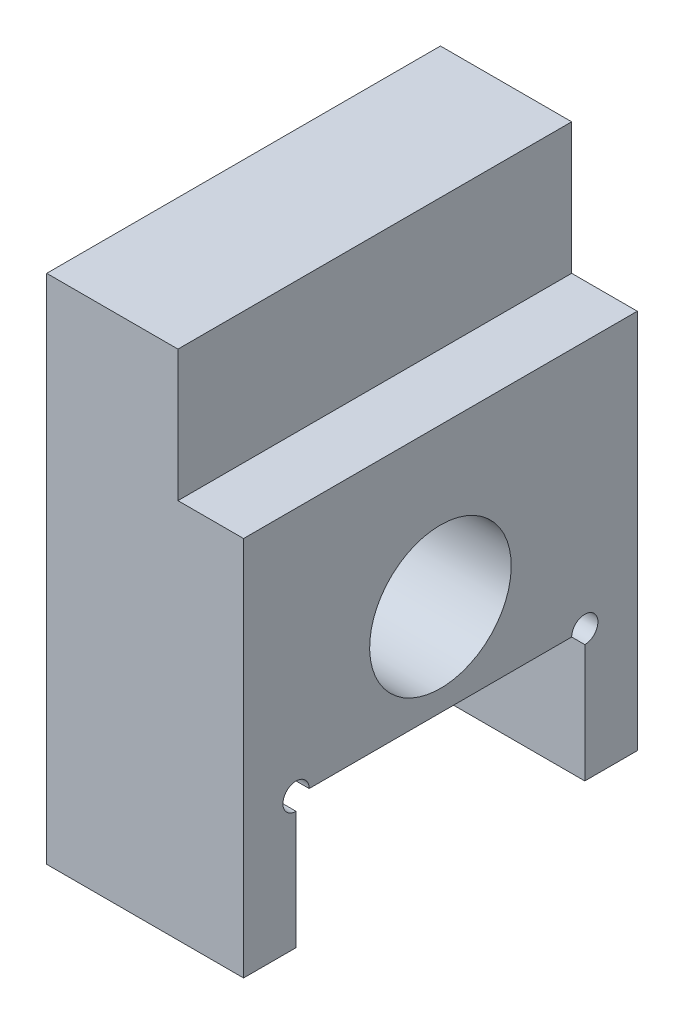
ISO-10303-21;
HEADER;
FILE_DESCRIPTION(('STEP AP214'),'2;1');
FILE_NAME('part.step','',(''),(''),'','','');
FILE_SCHEMA(('AUTOMOTIVE_DESIGN { 1 0 10303 214 1 1 1 1 }'));
ENDSEC;
DATA;
#1=APPLICATION_CONTEXT('core data for automotive mechanical design processes');
#2=APPLICATION_PROTOCOL_DEFINITION('international standard','automotive_design',2000,#1);
#3=PRODUCT_CONTEXT('',#1,'mechanical');
#4=PRODUCT('Part','Part','',(#3));
#5=PRODUCT_RELATED_PRODUCT_CATEGORY('part','',(#4));
#6=PRODUCT_DEFINITION_FORMATION('','',#4);
#7=PRODUCT_DEFINITION_CONTEXT('part definition',#1,'design');
#8=PRODUCT_DEFINITION('design','',#6,#7);
#9=PRODUCT_DEFINITION_SHAPE('','',#8);
#10=(LENGTH_UNIT() NAMED_UNIT(*) SI_UNIT(.MILLI.,.METRE.));
#11=(NAMED_UNIT(*) PLANE_ANGLE_UNIT() SI_UNIT($,.RADIAN.));
#12=(NAMED_UNIT(*) SI_UNIT($,.STERADIAN.) SOLID_ANGLE_UNIT());
#13=UNCERTAINTY_MEASURE_WITH_UNIT(LENGTH_MEASURE(1.E-05),#10,'distance_accuracy_value','');
#14=(GEOMETRIC_REPRESENTATION_CONTEXT(3) GLOBAL_UNCERTAINTY_ASSIGNED_CONTEXT((#13)) GLOBAL_UNIT_ASSIGNED_CONTEXT((#10,
#11,#12)) REPRESENTATION_CONTEXT('',''));
#15=CARTESIAN_POINT('',(0.,0.,0.));
#16=DIRECTION('',(0.,0.,1.));
#17=DIRECTION('',(1.,0.,0.));
#18=AXIS2_PLACEMENT_3D('',#15,#16,#17);
#19=CARTESIAN_POINT('',(0.,-39.,30.));
#20=DIRECTION('',(0.,1.,0.));
#21=DIRECTION('',(0.,0.,1.));
#22=AXIS2_PLACEMENT_3D('',#19,#20,#21);
#23=PLANE('',#22);
#24=DIRECTION('',(0.,0.,-1.));
#25=VECTOR('',#24,1.);
#26=CARTESIAN_POINT('',(0.,-39.,30.));
#27=LINE('',#26,#25);
#28=CARTESIAN_POINT('',(0.,-39.,30.));
#29=VERTEX_POINT('',#28);
#30=CARTESIAN_POINT('',(0.,-39.,26.));
#31=VERTEX_POINT('',#30);
#32=EDGE_CURVE('E250',#29,#31,#27,.T.);
#33=ORIENTED_EDGE('',*,*,#32,.T.);
#34=DIRECTION('',(1.,0.,0.));
#35=VECTOR('',#34,1.);
#36=CARTESIAN_POINT('',(0.,-39.,26.));
#37=LINE('',#36,#35);
#38=CARTESIAN_POINT('',(15.,-39.,26.));
#39=VERTEX_POINT('',#38);
#40=EDGE_CURVE('E189',#31,#39,#37,.T.);
#41=ORIENTED_EDGE('',*,*,#40,.T.);
#42=DIRECTION('',(0.,0.,-1.));
#43=VECTOR('',#42,1.);
#44=CARTESIAN_POINT('',(15.,-39.,30.));
#45=LINE('',#44,#43);
#46=CARTESIAN_POINT('',(15.,-39.,30.));
#47=VERTEX_POINT('',#46);
#48=EDGE_CURVE('E245',#47,#39,#45,.T.);
#49=ORIENTED_EDGE('',*,*,#48,.F.);
#50=DIRECTION('',(1.,0.,0.));
#51=VECTOR('',#50,1.);
#52=CARTESIAN_POINT('',(0.,-39.,30.));
#53=LINE('',#52,#51);
#54=EDGE_CURVE('E201',#29,#47,#53,.T.);
#55=ORIENTED_EDGE('',*,*,#54,.F.);
#56=EDGE_LOOP('',(#33,#41,#49,#55));
#57=FACE_BOUND('',#56,.T.);
#58=ADVANCED_FACE('F61',(#57),#23,.F.);
#59=CARTESIAN_POINT('',(10.,0.,30.));
#60=DIRECTION('',(0.,-1.,0.));
#61=DIRECTION('',(1.,0.,0.));
#62=AXIS2_PLACEMENT_3D('',#59,#60,#61);
#63=PLANE('',#62);
#64=DIRECTION('',(-1.,0.,0.));
#65=VECTOR('',#64,1.);
#66=CARTESIAN_POINT('',(10.,0.,0.));
#67=LINE('',#66,#65);
#68=CARTESIAN_POINT('',(10.,0.,0.));
#69=VERTEX_POINT('',#68);
#70=CARTESIAN_POINT('',(0.,0.,0.));
#71=VERTEX_POINT('',#70);
#72=EDGE_CURVE('E188',#69,#71,#67,.T.);
#73=ORIENTED_EDGE('',*,*,#72,.T.);
#74=DIRECTION('',(0.,0.,-1.));
#75=VECTOR('',#74,1.);
#76=CARTESIAN_POINT('',(0.,0.,30.));
#77=LINE('',#76,#75);
#78=CARTESIAN_POINT('',(0.,0.,30.));
#79=VERTEX_POINT('',#78);
#80=EDGE_CURVE('E254',#79,#71,#77,.T.);
#81=ORIENTED_EDGE('',*,*,#80,.F.);
#82=DIRECTION('',(-1.,0.,0.));
#83=VECTOR('',#82,1.);
#84=CARTESIAN_POINT('',(10.,0.,30.));
#85=LINE('',#84,#83);
#86=CARTESIAN_POINT('',(10.,0.,30.));
#87=VERTEX_POINT('',#86);
#88=EDGE_CURVE('E193',#87,#79,#85,.T.);
#89=ORIENTED_EDGE('',*,*,#88,.F.);
#90=DIRECTION('',(0.,0.,-1.));
#91=VECTOR('',#90,1.);
#92=CARTESIAN_POINT('',(10.,0.,30.));
#93=LINE('',#92,#91);
#94=EDGE_CURVE('E213',#87,#69,#93,.T.);
#95=ORIENTED_EDGE('',*,*,#94,.T.);
#96=EDGE_LOOP('',(#73,#81,#89,#95));
#97=FACE_BOUND('',#96,.T.);
#98=ADVANCED_FACE('F63',(#97),#63,.F.);
#99=CARTESIAN_POINT('',(0.,0.,30.));
#100=DIRECTION('',(1.,0.,0.));
#101=DIRECTION('',(0.,0.,-1.));
#102=AXIS2_PLACEMENT_3D('',#99,#100,#101);
#103=PLANE('',#102);
#104=CARTESIAN_POINT('',(0.,-22.,15.));
#105=DIRECTION('',(1.,0.,0.));
#106=DIRECTION('',(0.,1.,0.));
#107=AXIS2_PLACEMENT_3D('',#104,#105,#106);
#108=CIRCLE('',#107,5.39501277095895);
#109=CARTESIAN_POINT('',(0.,-16.604987229041,15.));
#110=VERTEX_POINT('',#109);
#111=EDGE_CURVE('E282',#110,#110,#108,.T.);
#112=ORIENTED_EDGE('',*,*,#111,.T.);
#113=EDGE_LOOP('',(#112));
#114=FACE_BOUND('',#113,.T.);
#115=DIRECTION('',(0.,0.,1.));
#116=VECTOR('',#115,1.);
#117=CARTESIAN_POINT('',(0.,-29.,26.));
#118=LINE('',#117,#116);
#119=CARTESIAN_POINT('',(0.,-29.,5.));
#120=VERTEX_POINT('',#119);
#121=CARTESIAN_POINT('',(0.,-29.,25.));
#122=VERTEX_POINT('',#121);
#123=EDGE_CURVE('E165',#120,#122,#118,.T.);
#124=ORIENTED_EDGE('',*,*,#123,.T.);
#125=CARTESIAN_POINT('',(0.,-29.,26.));
#126=DIRECTION('',(1.,0.,0.));
#127=DIRECTION('',(0.,1.,0.));
#128=AXIS2_PLACEMENT_3D('',#125,#126,#127);
#129=CIRCLE('',#128,1.);
#130=CARTESIAN_POINT('',(0.,-30.,26.));
#131=VERTEX_POINT('',#130);
#132=EDGE_CURVE('E77',#122,#131,#129,.T.);
#133=ORIENTED_EDGE('',*,*,#132,.T.);
#134=DIRECTION('',(0.,-1.,0.));
#135=VECTOR('',#134,1.);
#136=CARTESIAN_POINT('',(0.,-39.,26.));
#137=LINE('',#136,#135);
#138=EDGE_CURVE('E173',#131,#31,#137,.T.);
#139=ORIENTED_EDGE('',*,*,#138,.T.);
#140=ORIENTED_EDGE('',*,*,#32,.F.);
#141=DIRECTION('',(0.,-1.,0.));
#142=VECTOR('',#141,1.);
#143=CARTESIAN_POINT('',(0.,0.,30.));
#144=LINE('',#143,#142);
#145=EDGE_CURVE('E197',#79,#29,#144,.T.);
#146=ORIENTED_EDGE('',*,*,#145,.F.);
#147=ORIENTED_EDGE('',*,*,#80,.T.);
#148=DIRECTION('',(0.,-1.,0.));
#149=VECTOR('',#148,1.);
#150=CARTESIAN_POINT('',(0.,0.,0.));
#151=LINE('',#150,#149);
#152=CARTESIAN_POINT('',(0.,-39.,0.));
#153=VERTEX_POINT('',#152);
#154=EDGE_CURVE('E217',#71,#153,#151,.T.);
#155=ORIENTED_EDGE('',*,*,#154,.T.);
#156=CARTESIAN_POINT('',(0.,-39.,4.));
#157=VERTEX_POINT('',#156);
#158=EDGE_CURVE('E249',#157,#153,#27,.T.);
#159=ORIENTED_EDGE('',*,*,#158,.F.);
#160=DIRECTION('',(0.,1.,0.));
#161=VECTOR('',#160,1.);
#162=CARTESIAN_POINT('',(0.,-39.,4.));
#163=LINE('',#162,#161);
#164=CARTESIAN_POINT('',(0.,-30.,4.));
#165=VERTEX_POINT('',#164);
#166=EDGE_CURVE('E179',#157,#165,#163,.T.);
#167=ORIENTED_EDGE('',*,*,#166,.T.);
#168=CARTESIAN_POINT('',(0.,-29.,4.));
#169=DIRECTION('',(1.,0.,0.));
#170=DIRECTION('',(0.,1.,0.));
#171=AXIS2_PLACEMENT_3D('',#168,#169,#170);
#172=CIRCLE('',#171,1.);
#173=EDGE_CURVE('E84',#165,#120,#172,.T.);
#174=ORIENTED_EDGE('',*,*,#173,.T.);
#175=EDGE_LOOP('',(#124,#133,#139,#140,#146,#147,#155,#159,#167,#174));
#176=FACE_BOUND('',#175,.T.);
#177=ADVANCED_FACE('F265',(#114,#176),#103,.F.);
#178=CARTESIAN_POINT('',(15.,-39.,4.));
#179=VERTEX_POINT('',#178);
#180=CARTESIAN_POINT('',(15.,-39.,0.));
#181=VERTEX_POINT('',#180);
#182=EDGE_CURVE('E244',#179,#181,#45,.T.);
#183=ORIENTED_EDGE('',*,*,#182,.F.);
#184=DIRECTION('',(1.,0.,0.));
#185=VECTOR('',#184,1.);
#186=CARTESIAN_POINT('',(0.,-39.,4.));
#187=LINE('',#186,#185);
#188=EDGE_CURVE('E185',#157,#179,#187,.T.);
#189=ORIENTED_EDGE('',*,*,#188,.F.);
#190=ORIENTED_EDGE('',*,*,#158,.T.);
#191=DIRECTION('',(1.,0.,0.));
#192=VECTOR('',#191,1.);
#193=CARTESIAN_POINT('',(0.,-39.,0.));
#194=LINE('',#193,#192);
#195=EDGE_CURVE('E221',#153,#181,#194,.T.);
#196=ORIENTED_EDGE('',*,*,#195,.T.);
#197=EDGE_LOOP('',(#183,#189,#190,#196));
#198=FACE_BOUND('',#197,.T.);
#199=ADVANCED_FACE('F307',(#198),#23,.F.);
#200=CARTESIAN_POINT('',(15.,-39.,30.));
#201=DIRECTION('',(-1.,0.,0.));
#202=DIRECTION('',(0.,-1.,0.));
#203=AXIS2_PLACEMENT_3D('',#200,#201,#202);
#204=PLANE('',#203);
#205=CARTESIAN_POINT('',(15.,-22.,15.));
#206=DIRECTION('',(1.,0.,0.));
#207=DIRECTION('',(0.,1.,0.));
#208=AXIS2_PLACEMENT_3D('',#205,#206,#207);
#209=CIRCLE('',#208,5.39501277095895);
#210=CARTESIAN_POINT('',(15.,-16.604987229041,15.));
#211=VERTEX_POINT('',#210);
#212=EDGE_CURVE('E288',#211,#211,#209,.T.);
#213=ORIENTED_EDGE('',*,*,#212,.F.);
#214=EDGE_LOOP('',(#213));
#215=FACE_BOUND('',#214,.T.);
#216=DIRECTION('',(0.,-1.,0.));
#217=VECTOR('',#216,1.);
#218=CARTESIAN_POINT('',(15.,-39.,26.));
#219=LINE('',#218,#217);
#220=CARTESIAN_POINT('',(15.,-30.,26.));
#221=VERTEX_POINT('',#220);
#222=EDGE_CURVE('E181',#221,#39,#219,.T.);
#223=ORIENTED_EDGE('',*,*,#222,.F.);
#224=CARTESIAN_POINT('',(15.,-29.,26.));
#225=DIRECTION('',(1.,0.,0.));
#226=DIRECTION('',(0.,1.,0.));
#227=AXIS2_PLACEMENT_3D('',#224,#225,#226);
#228=CIRCLE('',#227,1.);
#229=CARTESIAN_POINT('',(15.,-29.,25.));
#230=VERTEX_POINT('',#229);
#231=EDGE_CURVE('E157',#230,#221,#228,.T.);
#232=ORIENTED_EDGE('',*,*,#231,.F.);
#233=DIRECTION('',(0.,0.,1.));
#234=VECTOR('',#233,1.);
#235=CARTESIAN_POINT('',(15.,-29.,26.));
#236=LINE('',#235,#234);
#237=CARTESIAN_POINT('',(15.,-29.,5.));
#238=VERTEX_POINT('',#237);
#239=EDGE_CURVE('E163',#238,#230,#236,.T.);
#240=ORIENTED_EDGE('',*,*,#239,.F.);
#241=CARTESIAN_POINT('',(15.,-29.,4.));
#242=DIRECTION('',(1.,0.,0.));
#243=DIRECTION('',(0.,1.,0.));
#244=AXIS2_PLACEMENT_3D('',#241,#242,#243);
#245=CIRCLE('',#244,1.);
#246=CARTESIAN_POINT('',(15.,-30.,4.));
#247=VERTEX_POINT('',#246);
#248=EDGE_CURVE('E148',#247,#238,#245,.T.);
#249=ORIENTED_EDGE('',*,*,#248,.F.);
#250=DIRECTION('',(0.,1.,0.));
#251=VECTOR('',#250,1.);
#252=CARTESIAN_POINT('',(15.,-39.,4.));
#253=LINE('',#252,#251);
#254=EDGE_CURVE('E174',#179,#247,#253,.T.);
#255=ORIENTED_EDGE('',*,*,#254,.F.);
#256=ORIENTED_EDGE('',*,*,#182,.T.);
#257=DIRECTION('',(0.,1.,0.));
#258=VECTOR('',#257,1.);
#259=CARTESIAN_POINT('',(15.,-39.,0.));
#260=LINE('',#259,#258);
#261=CARTESIAN_POINT('',(15.,-10.,0.));
#262=VERTEX_POINT('',#261);
#263=EDGE_CURVE('E225',#181,#262,#260,.T.);
#264=ORIENTED_EDGE('',*,*,#263,.T.);
#265=DIRECTION('',(0.,0.,-1.));
#266=VECTOR('',#265,1.);
#267=CARTESIAN_POINT('',(15.,-10.,30.));
#268=LINE('',#267,#266);
#269=CARTESIAN_POINT('',(15.,-10.,30.));
#270=VERTEX_POINT('',#269);
#271=EDGE_CURVE('E240',#270,#262,#268,.T.);
#272=ORIENTED_EDGE('',*,*,#271,.F.);
#273=DIRECTION('',(0.,1.,0.));
#274=VECTOR('',#273,1.);
#275=CARTESIAN_POINT('',(15.,-39.,30.));
#276=LINE('',#275,#274);
#277=EDGE_CURVE('E204',#47,#270,#276,.T.);
#278=ORIENTED_EDGE('',*,*,#277,.F.);
#279=ORIENTED_EDGE('',*,*,#48,.T.);
#280=EDGE_LOOP('',(#223,#232,#240,#249,#255,#256,#264,#272,#278,#279));
#281=FACE_BOUND('',#280,.T.);
#282=ADVANCED_FACE('F171',(#215,#281),#204,.F.);
#283=CARTESIAN_POINT('',(15.,-10.,30.));
#284=DIRECTION('',(0.,-1.,0.));
#285=DIRECTION('',(0.,0.,-1.));
#286=AXIS2_PLACEMENT_3D('',#283,#284,#285);
#287=PLANE('',#286);
#288=DIRECTION('',(-1.,0.,0.));
#289=VECTOR('',#288,1.);
#290=CARTESIAN_POINT('',(15.,-10.,0.));
#291=LINE('',#290,#289);
#292=CARTESIAN_POINT('',(10.,-10.,0.));
#293=VERTEX_POINT('',#292);
#294=EDGE_CURVE('E228',#262,#293,#291,.T.);
#295=ORIENTED_EDGE('',*,*,#294,.T.);
#296=DIRECTION('',(0.,0.,-1.));
#297=VECTOR('',#296,1.);
#298=CARTESIAN_POINT('',(10.,-10.,30.));
#299=LINE('',#298,#297);
#300=CARTESIAN_POINT('',(10.,-10.,30.));
#301=VERTEX_POINT('',#300);
#302=EDGE_CURVE('E236',#301,#293,#299,.T.);
#303=ORIENTED_EDGE('',*,*,#302,.F.);
#304=DIRECTION('',(-1.,0.,0.));
#305=VECTOR('',#304,1.);
#306=CARTESIAN_POINT('',(15.,-10.,30.));
#307=LINE('',#306,#305);
#308=EDGE_CURVE('E207',#270,#301,#307,.T.);
#309=ORIENTED_EDGE('',*,*,#308,.F.);
#310=ORIENTED_EDGE('',*,*,#271,.T.);
#311=EDGE_LOOP('',(#295,#303,#309,#310));
#312=FACE_BOUND('',#311,.T.);
#313=ADVANCED_FACE('F306',(#312),#287,.F.);
#314=CARTESIAN_POINT('',(10.,-10.,30.));
#315=DIRECTION('',(-1.,0.,0.));
#316=DIRECTION('',(0.,0.,1.));
#317=AXIS2_PLACEMENT_3D('',#314,#315,#316);
#318=PLANE('',#317);
#319=DIRECTION('',(0.,1.,0.));
#320=VECTOR('',#319,1.);
#321=CARTESIAN_POINT('',(10.,-10.,0.));
#322=LINE('',#321,#320);
#323=EDGE_CURVE('E198',#293,#69,#322,.T.);
#324=ORIENTED_EDGE('',*,*,#323,.T.);
#325=ORIENTED_EDGE('',*,*,#94,.F.);
#326=DIRECTION('',(0.,1.,0.));
#327=VECTOR('',#326,1.);
#328=CARTESIAN_POINT('',(10.,-10.,30.));
#329=LINE('',#328,#327);
#330=EDGE_CURVE('E210',#301,#87,#329,.T.);
#331=ORIENTED_EDGE('',*,*,#330,.F.);
#332=ORIENTED_EDGE('',*,*,#302,.T.);
#333=EDGE_LOOP('',(#324,#325,#331,#332));
#334=FACE_BOUND('',#333,.T.);
#335=ADVANCED_FACE('F313',(#334),#318,.F.);
#336=CARTESIAN_POINT('',(0.,0.,30.));
#337=DIRECTION('',(0.,0.,1.));
#338=DIRECTION('',(1.,0.,0.));
#339=AXIS2_PLACEMENT_3D('',#336,#337,#338);
#340=PLANE('',#339);
#341=ORIENTED_EDGE('',*,*,#88,.T.);
#342=ORIENTED_EDGE('',*,*,#145,.T.);
#343=ORIENTED_EDGE('',*,*,#54,.T.);
#344=ORIENTED_EDGE('',*,*,#277,.T.);
#345=ORIENTED_EDGE('',*,*,#308,.T.);
#346=ORIENTED_EDGE('',*,*,#330,.T.);
#347=EDGE_LOOP('',(#341,#342,#343,#344,#345,#346));
#348=FACE_BOUND('',#347,.T.);
#349=ADVANCED_FACE('F355',(#348),#340,.T.);
#350=CARTESIAN_POINT('',(0.,0.,0.));
#351=DIRECTION('',(0.,0.,1.));
#352=DIRECTION('',(1.,0.,0.));
#353=AXIS2_PLACEMENT_3D('',#350,#351,#352);
#354=PLANE('',#353);
#355=ORIENTED_EDGE('',*,*,#72,.F.);
#356=ORIENTED_EDGE('',*,*,#323,.F.);
#357=ORIENTED_EDGE('',*,*,#294,.F.);
#358=ORIENTED_EDGE('',*,*,#263,.F.);
#359=ORIENTED_EDGE('',*,*,#195,.F.);
#360=ORIENTED_EDGE('',*,*,#154,.F.);
#361=EDGE_LOOP('',(#355,#356,#357,#358,#359,#360));
#362=FACE_BOUND('',#361,.T.);
#363=ADVANCED_FACE('F366',(#362),#354,.F.);
#364=CARTESIAN_POINT('',(0.,-39.,26.));
#365=DIRECTION('',(0.,0.,1.));
#366=DIRECTION('',(1.,0.,0.));
#367=AXIS2_PLACEMENT_3D('',#364,#365,#366);
#368=PLANE('',#367);
#369=ORIENTED_EDGE('',*,*,#138,.F.);
#370=DIRECTION('',(1.,0.,0.));
#371=VECTOR('',#370,1.);
#372=CARTESIAN_POINT('',(0.,-30.,26.));
#373=LINE('',#372,#371);
#374=EDGE_CURVE('E167',#131,#221,#373,.T.);
#375=ORIENTED_EDGE('',*,*,#374,.T.);
#376=ORIENTED_EDGE('',*,*,#222,.T.);
#377=ORIENTED_EDGE('',*,*,#40,.F.);
#378=EDGE_LOOP('',(#369,#375,#376,#377));
#379=FACE_BOUND('',#378,.T.);
#380=ADVANCED_FACE('F377',(#379),#368,.F.);
#381=CARTESIAN_POINT('',(0.,-29.,26.));
#382=DIRECTION('',(0.,1.,0.));
#383=DIRECTION('',(-1.,0.,0.));
#384=AXIS2_PLACEMENT_3D('',#381,#382,#383);
#385=PLANE('',#384);
#386=ORIENTED_EDGE('',*,*,#239,.T.);
#387=DIRECTION('',(1.,0.,0.));
#388=VECTOR('',#387,1.);
#389=CARTESIAN_POINT('',(0.,-29.,25.));
#390=LINE('',#389,#388);
#391=EDGE_CURVE('E13',#230,#122,#390,.F.);
#392=ORIENTED_EDGE('',*,*,#391,.T.);
#393=ORIENTED_EDGE('',*,*,#123,.F.);
#394=DIRECTION('',(1.,0.,0.));
#395=VECTOR('',#394,1.);
#396=CARTESIAN_POINT('',(0.,-29.,5.));
#397=LINE('',#396,#395);
#398=EDGE_CURVE('E151',#120,#238,#397,.T.);
#399=ORIENTED_EDGE('',*,*,#398,.T.);
#400=EDGE_LOOP('',(#386,#392,#393,#399));
#401=FACE_BOUND('',#400,.T.);
#402=ADVANCED_FACE('F162',(#401),#385,.F.);
#403=CARTESIAN_POINT('',(0.,-39.,4.));
#404=DIRECTION('',(0.,0.,-1.));
#405=DIRECTION('',(-1.,0.,0.));
#406=AXIS2_PLACEMENT_3D('',#403,#404,#405);
#407=PLANE('',#406);
#408=ORIENTED_EDGE('',*,*,#254,.T.);
#409=DIRECTION('',(1.,0.,0.));
#410=VECTOR('',#409,1.);
#411=CARTESIAN_POINT('',(0.,-30.,4.));
#412=LINE('',#411,#410);
#413=EDGE_CURVE('E70',#247,#165,#412,.F.);
#414=ORIENTED_EDGE('',*,*,#413,.T.);
#415=ORIENTED_EDGE('',*,*,#166,.F.);
#416=ORIENTED_EDGE('',*,*,#188,.T.);
#417=EDGE_LOOP('',(#408,#414,#415,#416));
#418=FACE_BOUND('',#417,.T.);
#419=ADVANCED_FACE('F261',(#418),#407,.F.);
#420=CARTESIAN_POINT('',(0.,-29.,4.));
#421=DIRECTION('',(1.,0.,0.));
#422=DIRECTION('',(0.,1.,0.));
#423=AXIS2_PLACEMENT_3D('',#420,#421,#422);
#424=CYLINDRICAL_SURFACE('',#423,1.);
#425=ORIENTED_EDGE('',*,*,#173,.F.);
#426=ORIENTED_EDGE('',*,*,#413,.F.);
#427=ORIENTED_EDGE('',*,*,#248,.T.);
#428=ORIENTED_EDGE('',*,*,#398,.F.);
#429=EDGE_LOOP('',(#425,#426,#427,#428));
#430=FACE_BOUND('',#429,.T.);
#431=ADVANCED_FACE('F150',(#430),#424,.F.);
#432=CARTESIAN_POINT('',(0.,-29.,26.));
#433=DIRECTION('',(1.,0.,0.));
#434=DIRECTION('',(0.,1.,0.));
#435=AXIS2_PLACEMENT_3D('',#432,#433,#434);
#436=CYLINDRICAL_SURFACE('',#435,1.);
#437=ORIENTED_EDGE('',*,*,#132,.F.);
#438=ORIENTED_EDGE('',*,*,#391,.F.);
#439=ORIENTED_EDGE('',*,*,#231,.T.);
#440=ORIENTED_EDGE('',*,*,#374,.F.);
#441=EDGE_LOOP('',(#437,#438,#439,#440));
#442=FACE_BOUND('',#441,.T.);
#443=ADVANCED_FACE('F301',(#442),#436,.F.);
#444=CARTESIAN_POINT('',(0.,-22.,15.));
#445=DIRECTION('',(1.,0.,0.));
#446=DIRECTION('',(0.,1.,0.));
#447=AXIS2_PLACEMENT_3D('',#444,#445,#446);
#448=CYLINDRICAL_SURFACE('',#447,5.39501277095895);
#449=ORIENTED_EDGE('',*,*,#111,.F.);
#450=EDGE_LOOP('',(#449));
#451=FACE_BOUND('',#450,.T.);
#452=ORIENTED_EDGE('',*,*,#212,.T.);
#453=EDGE_LOOP('',(#452));
#454=FACE_BOUND('',#453,.T.);
#455=ADVANCED_FACE('F298',(#451,#454),#448,.F.);
#456=CLOSED_SHELL('',(#58,#98,#177,#199,#282,#313,#335,#349,#363,#380,#402,#419,#431,#443,#455));
#457=MANIFOLD_SOLID_BREP('B2',#456);
#458=ADVANCED_BREP_SHAPE_REPRESENTATION('',(#18,#457),#14);
#459=SHAPE_DEFINITION_REPRESENTATION(#9,#458);
ENDSEC;
END-ISO-10303-21;
